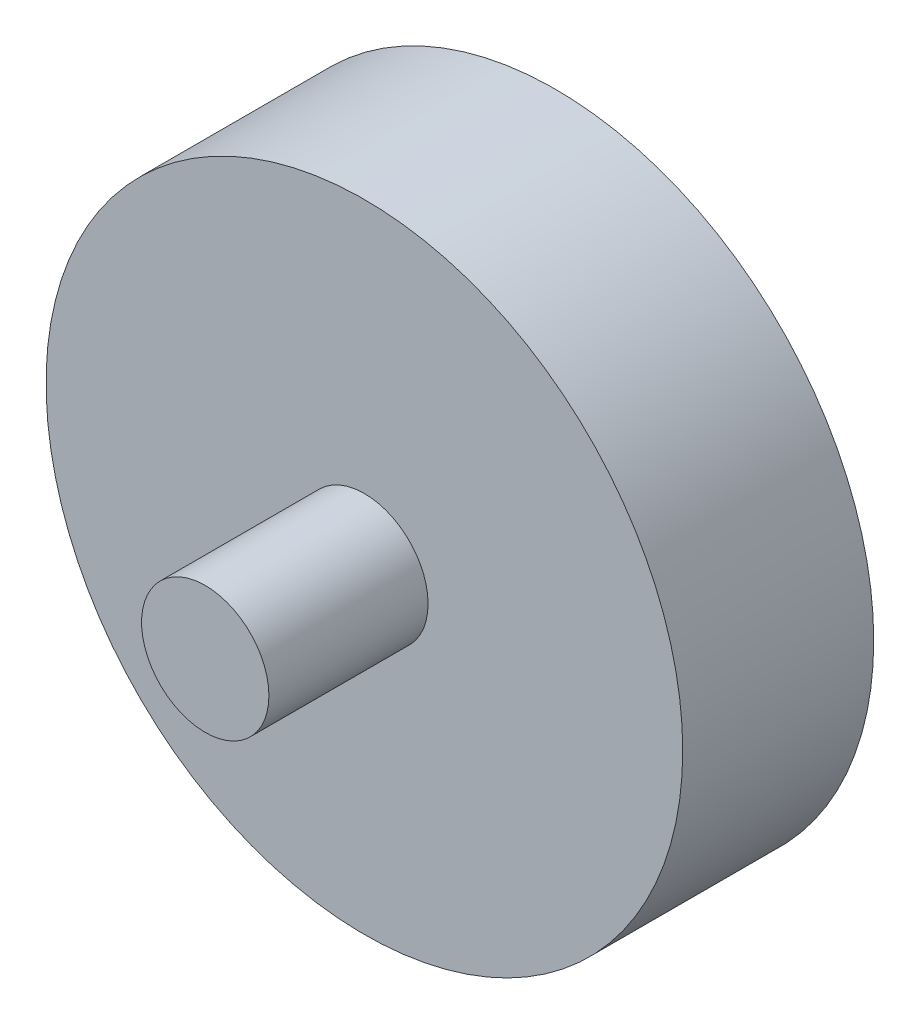
ISO-10303-21;
HEADER;
FILE_DESCRIPTION(('STEP AP214'),'2;1');
FILE_NAME('part.step','',(''),(''),'','','');
FILE_SCHEMA(('AUTOMOTIVE_DESIGN { 1 0 10303 214 1 1 1 1 }'));
ENDSEC;
DATA;
#1=APPLICATION_CONTEXT('core data for automotive mechanical design processes');
#2=APPLICATION_PROTOCOL_DEFINITION('international standard','automotive_design',2000,#1);
#3=PRODUCT_CONTEXT('',#1,'mechanical');
#4=PRODUCT('Part','Part','',(#3));
#5=PRODUCT_RELATED_PRODUCT_CATEGORY('part','',(#4));
#6=PRODUCT_DEFINITION_FORMATION('','',#4);
#7=PRODUCT_DEFINITION_CONTEXT('part definition',#1,'design');
#8=PRODUCT_DEFINITION('design','',#6,#7);
#9=PRODUCT_DEFINITION_SHAPE('','',#8);
#10=(LENGTH_UNIT() NAMED_UNIT(*) SI_UNIT(.MILLI.,.METRE.));
#11=(NAMED_UNIT(*) PLANE_ANGLE_UNIT() SI_UNIT($,.RADIAN.));
#12=(NAMED_UNIT(*) SI_UNIT($,.STERADIAN.) SOLID_ANGLE_UNIT());
#13=UNCERTAINTY_MEASURE_WITH_UNIT(LENGTH_MEASURE(1.E-05),#10,'distance_accuracy_value','');
#14=(GEOMETRIC_REPRESENTATION_CONTEXT(3) GLOBAL_UNCERTAINTY_ASSIGNED_CONTEXT((#13)) GLOBAL_UNIT_ASSIGNED_CONTEXT((#10,
#11,#12)) REPRESENTATION_CONTEXT('',''));
#15=CARTESIAN_POINT('',(0.,0.,0.));
#16=DIRECTION('',(0.,0.,1.));
#17=DIRECTION('',(1.,0.,0.));
#18=AXIS2_PLACEMENT_3D('',#15,#16,#17);
#19=CARTESIAN_POINT('',(0.,0.,10.));
#20=DIRECTION('',(0.,0.,-1.));
#21=DIRECTION('',(-1.,0.,0.));
#22=AXIS2_PLACEMENT_3D('',#19,#20,#21);
#23=CYLINDRICAL_SURFACE('',#22,4.);
#24=CARTESIAN_POINT('',(0.,0.,10.));
#25=DIRECTION('',(0.,0.,1.));
#26=DIRECTION('',(1.,0.,0.));
#27=AXIS2_PLACEMENT_3D('',#24,#25,#26);
#28=CIRCLE('',#27,4.);
#29=CARTESIAN_POINT('',(4.,0.,10.));
#30=VERTEX_POINT('',#29);
#31=EDGE_CURVE('E11',#30,#30,#28,.T.);
#32=ORIENTED_EDGE('',*,*,#31,.F.);
#33=EDGE_LOOP('',(#32));
#34=FACE_BOUND('',#33,.T.);
#35=CARTESIAN_POINT('',(0.,0.,0.));
#36=DIRECTION('',(0.,0.,1.));
#37=DIRECTION('',(1.,0.,0.));
#38=AXIS2_PLACEMENT_3D('',#35,#36,#37);
#39=CIRCLE('',#38,4.);
#40=CARTESIAN_POINT('',(4.,0.,0.));
#41=VERTEX_POINT('',#40);
#42=EDGE_CURVE('E53',#41,#41,#39,.T.);
#43=ORIENTED_EDGE('',*,*,#42,.T.);
#44=EDGE_LOOP('',(#43));
#45=FACE_BOUND('',#44,.T.);
#46=ADVANCED_FACE('F51',(#34,#45),#23,.T.);
#47=CARTESIAN_POINT('',(0.,0.,10.));
#48=DIRECTION('',(0.,0.,1.));
#49=DIRECTION('',(1.,0.,0.));
#50=AXIS2_PLACEMENT_3D('',#47,#48,#49);
#51=PLANE('',#50);
#52=ORIENTED_EDGE('',*,*,#31,.T.);
#53=EDGE_LOOP('',(#52));
#54=FACE_BOUND('',#53,.T.);
#55=ADVANCED_FACE('F67',(#54),#51,.T.);
#56=CARTESIAN_POINT('',(0.,0.,0.));
#57=DIRECTION('',(0.,0.,1.));
#58=DIRECTION('',(1.,0.,0.));
#59=AXIS2_PLACEMENT_3D('',#56,#57,#58);
#60=PLANE('',#59);
#61=ORIENTED_EDGE('',*,*,#42,.F.);
#62=EDGE_LOOP('',(#61));
#63=FACE_BOUND('',#62,.T.);
#64=ADVANCED_FACE('F64',(#63),#60,.F.);
#65=CLOSED_SHELL('',(#46,#55,#64));
#66=MANIFOLD_SOLID_BREP('B2',#65);
#67=CARTESIAN_POINT('',(0.,0.,-12.));
#68=DIRECTION('',(0.,0.,1.));
#69=DIRECTION('',(1.,0.,0.));
#70=AXIS2_PLACEMENT_3D('',#67,#68,#69);
#71=CYLINDRICAL_SURFACE('',#70,20.);
#72=CARTESIAN_POINT('',(0.,0.,-12.));
#73=DIRECTION('',(0.,0.,1.));
#74=DIRECTION('',(1.,0.,0.));
#75=AXIS2_PLACEMENT_3D('',#72,#73,#74);
#76=CIRCLE('',#75,20.);
#77=CARTESIAN_POINT('',(20.,0.,-12.));
#78=VERTEX_POINT('',#77);
#79=EDGE_CURVE('E119',#78,#78,#76,.T.);
#80=ORIENTED_EDGE('',*,*,#79,.T.);
#81=EDGE_LOOP('',(#80));
#82=FACE_BOUND('',#81,.T.);
#83=CARTESIAN_POINT('',(0.,0.,0.));
#84=DIRECTION('',(0.,0.,1.));
#85=DIRECTION('',(1.,0.,0.));
#86=AXIS2_PLACEMENT_3D('',#83,#84,#85);
#87=CIRCLE('',#86,20.);
#88=CARTESIAN_POINT('',(20.,0.,0.));
#89=VERTEX_POINT('',#88);
#90=EDGE_CURVE('E121',#89,#89,#87,.T.);
#91=ORIENTED_EDGE('',*,*,#90,.F.);
#92=EDGE_LOOP('',(#91));
#93=FACE_BOUND('',#92,.T.);
#94=ADVANCED_FACE('F115',(#82,#93),#71,.T.);
#95=CARTESIAN_POINT('',(0.,0.,-12.));
#96=DIRECTION('',(0.,0.,1.));
#97=DIRECTION('',(1.,0.,0.));
#98=AXIS2_PLACEMENT_3D('',#95,#96,#97);
#99=PLANE('',#98);
#100=CARTESIAN_POINT('',(0.,0.,-12.));
#101=DIRECTION('',(0.,0.,1.));
#102=DIRECTION('',(1.,0.,0.));
#103=AXIS2_PLACEMENT_3D('',#100,#101,#102);
#104=CIRCLE('',#103,16.);
#105=CARTESIAN_POINT('',(16.,0.,-12.));
#106=VERTEX_POINT('',#105);
#107=EDGE_CURVE('E49',#106,#106,#104,.T.);
#108=ORIENTED_EDGE('',*,*,#107,.T.);
#109=EDGE_LOOP('',(#108));
#110=FACE_BOUND('',#109,.T.);
#111=ORIENTED_EDGE('',*,*,#79,.F.);
#112=EDGE_LOOP('',(#111));
#113=FACE_BOUND('',#112,.T.);
#114=ADVANCED_FACE('F143',(#110,#113),#99,.F.);
#115=CARTESIAN_POINT('',(0.,0.,0.));
#116=DIRECTION('',(0.,0.,1.));
#117=DIRECTION('',(1.,0.,0.));
#118=AXIS2_PLACEMENT_3D('',#115,#116,#117);
#119=PLANE('',#118);
#120=ORIENTED_EDGE('',*,*,#90,.T.);
#121=EDGE_LOOP('',(#120));
#122=FACE_BOUND('',#121,.T.);
#123=ADVANCED_FACE('F145',(#122),#119,.T.);
#124=CARTESIAN_POINT('',(0.,0.,-11.));
#125=DIRECTION('',(0.,0.,-1.));
#126=DIRECTION('',(-1.,0.,0.));
#127=AXIS2_PLACEMENT_3D('',#124,#125,#126);
#128=PLANE('',#127);
#129=CARTESIAN_POINT('',(0.,0.,-11.));
#130=DIRECTION('',(0.,0.,-1.));
#131=DIRECTION('',(-1.,0.,0.));
#132=AXIS2_PLACEMENT_3D('',#129,#130,#131);
#133=CIRCLE('',#132,15.);
#134=CARTESIAN_POINT('',(-15.,0.,-11.));
#135=VERTEX_POINT('',#134);
#136=EDGE_CURVE('E129',#135,#135,#133,.T.);
#137=ORIENTED_EDGE('',*,*,#136,.T.);
#138=EDGE_LOOP('',(#137));
#139=FACE_BOUND('',#138,.T.);
#140=ADVANCED_FACE('F131',(#139),#128,.T.);
#141=CARTESIAN_POINT('',(0.,0.,-11.));
#142=DIRECTION('',(0.,0.,-1.));
#143=DIRECTION('',(-1.,0.,0.));
#144=AXIS2_PLACEMENT_3D('',#141,#142,#143);
#145=CONICAL_SURFACE('',#144,15.,0.785398163397449);
#146=ORIENTED_EDGE('',*,*,#107,.F.);
#147=EDGE_LOOP('',(#146));
#148=FACE_BOUND('',#147,.T.);
#149=ORIENTED_EDGE('',*,*,#136,.F.);
#150=EDGE_LOOP('',(#149));
#151=FACE_BOUND('',#150,.T.);
#152=ADVANCED_FACE('F114',(#148,#151),#145,.F.);
#153=CLOSED_SHELL('',(#94,#114,#123,#140,#152));
#154=MANIFOLD_SOLID_BREP('B6',#153);
#155=ADVANCED_BREP_SHAPE_REPRESENTATION('',(#18,#66,#154),#14);
#156=SHAPE_DEFINITION_REPRESENTATION(#9,#155);
ENDSEC;
END-ISO-10303-21;
